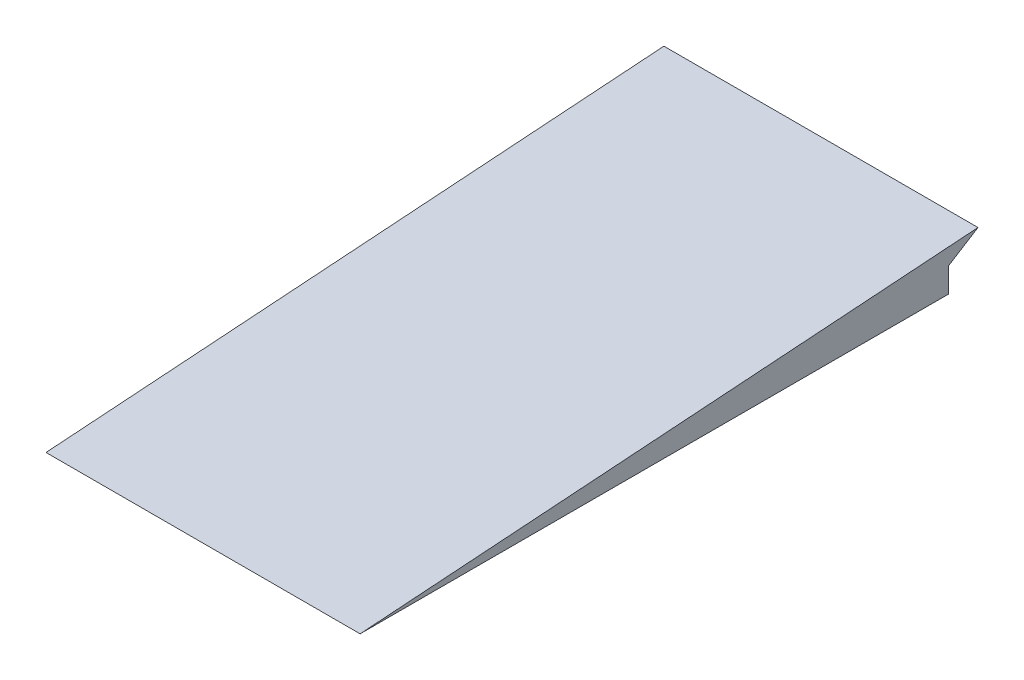
ISO-10303-21;
HEADER;
FILE_DESCRIPTION(('STEP AP214'),'2;1');
FILE_NAME('part.step','',(''),(''),'','','');
FILE_SCHEMA(('AUTOMOTIVE_DESIGN { 1 0 10303 214 1 1 1 1 }'));
ENDSEC;
DATA;
#1=APPLICATION_CONTEXT('core data for automotive mechanical design processes');
#2=APPLICATION_PROTOCOL_DEFINITION('international standard','automotive_design',2000,#1);
#3=PRODUCT_CONTEXT('',#1,'mechanical');
#4=PRODUCT('Part','Part','',(#3));
#5=PRODUCT_RELATED_PRODUCT_CATEGORY('part','',(#4));
#6=PRODUCT_DEFINITION_FORMATION('','',#4);
#7=PRODUCT_DEFINITION_CONTEXT('part definition',#1,'design');
#8=PRODUCT_DEFINITION('design','',#6,#7);
#9=PRODUCT_DEFINITION_SHAPE('','',#8);
#10=(LENGTH_UNIT() NAMED_UNIT(*) SI_UNIT(.MILLI.,.METRE.));
#11=(NAMED_UNIT(*) PLANE_ANGLE_UNIT() SI_UNIT($,.RADIAN.));
#12=(NAMED_UNIT(*) SI_UNIT($,.STERADIAN.) SOLID_ANGLE_UNIT());
#13=UNCERTAINTY_MEASURE_WITH_UNIT(LENGTH_MEASURE(1.E-05),#10,'distance_accuracy_value','');
#14=(GEOMETRIC_REPRESENTATION_CONTEXT(3) GLOBAL_UNCERTAINTY_ASSIGNED_CONTEXT((#13)) GLOBAL_UNIT_ASSIGNED_CONTEXT((#10,
#11,#12)) REPRESENTATION_CONTEXT('',''));
#15=CARTESIAN_POINT('',(0.,0.,0.));
#16=DIRECTION('',(0.,0.,1.));
#17=DIRECTION('',(1.,0.,0.));
#18=AXIS2_PLACEMENT_3D('',#15,#16,#17);
#19=CARTESIAN_POINT('',(812.8,0.,-3045.35301730358));
#20=DIRECTION('',(0.,1.,0.));
#21=DIRECTION('',(0.,0.,1.));
#22=AXIS2_PLACEMENT_3D('',#19,#20,#21);
#23=PLANE('',#22);
#24=DIRECTION('',(0.,0.,-1.));
#25=VECTOR('',#24,1.);
#26=CARTESIAN_POINT('',(-812.8,0.,-3045.35301730358));
#27=LINE('',#26,#25);
#28=CARTESIAN_POINT('',(-812.8,0.,0.));
#29=VERTEX_POINT('',#28);
#30=CARTESIAN_POINT('',(-812.8,0.,-3045.35301730358));
#31=VERTEX_POINT('',#30);
#32=EDGE_CURVE('E86',#29,#31,#27,.T.);
#33=ORIENTED_EDGE('',*,*,#32,.T.);
#34=DIRECTION('',(-1.,0.,0.));
#35=VECTOR('',#34,1.);
#36=CARTESIAN_POINT('',(812.8,0.,-3045.35301730358));
#37=LINE('',#36,#35);
#38=CARTESIAN_POINT('',(812.8,0.,-3045.35301730358));
#39=VERTEX_POINT('',#38);
#40=EDGE_CURVE('E11',#39,#31,#37,.T.);
#41=ORIENTED_EDGE('',*,*,#40,.F.);
#42=DIRECTION('',(0.,0.,-1.));
#43=VECTOR('',#42,1.);
#44=CARTESIAN_POINT('',(812.8,0.,-3045.35301730358));
#45=LINE('',#44,#43);
#46=CARTESIAN_POINT('',(812.8,0.,0.));
#47=VERTEX_POINT('',#46);
#48=EDGE_CURVE('E49',#47,#39,#45,.T.);
#49=ORIENTED_EDGE('',*,*,#48,.F.);
#50=DIRECTION('',(-1.,0.,0.));
#51=VECTOR('',#50,1.);
#52=CARTESIAN_POINT('',(812.8,0.,0.));
#53=LINE('',#52,#51);
#54=EDGE_CURVE('E79',#47,#29,#53,.T.);
#55=ORIENTED_EDGE('',*,*,#54,.T.);
#56=EDGE_LOOP('',(#33,#41,#49,#55));
#57=FACE_BOUND('',#56,.T.);
#58=ADVANCED_FACE('F33',(#57),#23,.F.);
#59=CARTESIAN_POINT('',(812.8,127.,-3045.35301730358));
#60=DIRECTION('',(0.,0.,1.));
#61=DIRECTION('',(1.,0.,0.));
#62=AXIS2_PLACEMENT_3D('',#59,#60,#61);
#63=PLANE('',#62);
#64=DIRECTION('',(0.,1.,0.));
#65=VECTOR('',#64,1.);
#66=CARTESIAN_POINT('',(-812.8,127.,-3045.35301730358));
#67=LINE('',#66,#65);
#68=CARTESIAN_POINT('',(-812.8,127.,-3045.35301730358));
#69=VERTEX_POINT('',#68);
#70=EDGE_CURVE('E62',#31,#69,#67,.T.);
#71=ORIENTED_EDGE('',*,*,#70,.T.);
#72=DIRECTION('',(-1.,0.,0.));
#73=VECTOR('',#72,1.);
#74=CARTESIAN_POINT('',(812.8,127.,-3045.35301730358));
#75=LINE('',#74,#73);
#76=CARTESIAN_POINT('',(812.8,127.,-3045.35301730358));
#77=VERTEX_POINT('',#76);
#78=EDGE_CURVE('E41',#77,#69,#75,.T.);
#79=ORIENTED_EDGE('',*,*,#78,.F.);
#80=DIRECTION('',(0.,1.,0.));
#81=VECTOR('',#80,1.);
#82=CARTESIAN_POINT('',(812.8,127.,-3045.35301730358));
#83=LINE('',#82,#81);
#84=EDGE_CURVE('E72',#39,#77,#83,.T.);
#85=ORIENTED_EDGE('',*,*,#84,.F.);
#86=ORIENTED_EDGE('',*,*,#40,.T.);
#87=EDGE_LOOP('',(#71,#79,#85,#86));
#88=FACE_BOUND('',#87,.T.);
#89=ADVANCED_FACE('F73',(#88),#63,.F.);
#90=CARTESIAN_POINT('',(812.8,0.,0.));
#91=DIRECTION('',(1.,0.,0.));
#92=DIRECTION('',(0.,0.,-1.));
#93=AXIS2_PLACEMENT_3D('',#90,#91,#92);
#94=PLANE('',#93);
#95=ORIENTED_EDGE('',*,*,#48,.T.);
#96=ORIENTED_EDGE('',*,*,#84,.T.);
#97=DIRECTION('',(0.,0.52999894000318,-0.847998304005088));
#98=VECTOR('',#97,1.);
#99=CARTESIAN_POINT('',(812.8,127.,-3045.35301730358));
#100=LINE('',#99,#98);
#101=CARTESIAN_POINT('',(812.8,222.25,-3197.75301730358));
#102=VERTEX_POINT('',#101);
#103=EDGE_CURVE('E98',#77,#102,#100,.T.);
#104=ORIENTED_EDGE('',*,*,#103,.T.);
#105=DIRECTION('',(0.,-0.0693346685711697,0.997593456140389));
#106=VECTOR('',#105,1.);
#107=CARTESIAN_POINT('',(812.8,222.25,-3197.75301730358));
#108=LINE('',#107,#106);
#109=EDGE_CURVE('E84',#102,#47,#108,.T.);
#110=ORIENTED_EDGE('',*,*,#109,.T.);
#111=EDGE_LOOP('',(#95,#96,#104,#110));
#112=FACE_BOUND('',#111,.T.);
#113=ADVANCED_FACE('F82',(#112),#94,.T.);
#114=CARTESIAN_POINT('',(-812.8,0.,0.));
#115=DIRECTION('',(1.,0.,0.));
#116=DIRECTION('',(0.,0.,-1.));
#117=AXIS2_PLACEMENT_3D('',#114,#115,#116);
#118=PLANE('',#117);
#119=ORIENTED_EDGE('',*,*,#32,.F.);
#120=DIRECTION('',(0.,0.0693346685711697,-0.997593456140389));
#121=VECTOR('',#120,1.);
#122=CARTESIAN_POINT('',(-812.8,222.25,-3197.75301730358));
#123=LINE('',#122,#121);
#124=CARTESIAN_POINT('',(-812.8,222.25,-3197.75301730358));
#125=VERTEX_POINT('',#124);
#126=EDGE_CURVE('E91',#29,#125,#123,.T.);
#127=ORIENTED_EDGE('',*,*,#126,.T.);
#128=DIRECTION('',(0.,-0.52999894000318,0.847998304005088));
#129=VECTOR('',#128,1.);
#130=CARTESIAN_POINT('',(-812.8,127.,-3045.35301730358));
#131=LINE('',#130,#129);
#132=EDGE_CURVE('E88',#125,#69,#131,.T.);
#133=ORIENTED_EDGE('',*,*,#132,.T.);
#134=ORIENTED_EDGE('',*,*,#70,.F.);
#135=EDGE_LOOP('',(#119,#127,#133,#134));
#136=FACE_BOUND('',#135,.T.);
#137=ADVANCED_FACE('F105',(#136),#118,.F.);
#138=CARTESIAN_POINT('',(-4018.26711450517,222.25,-3197.75301730358));
#139=DIRECTION('',(0.,0.997593456140389,0.0693346685711697));
#140=DIRECTION('',(0.,-0.0693346685711697,0.997593456140389));
#141=AXIS2_PLACEMENT_3D('',#138,#139,#140);
#142=PLANE('',#141);
#143=ORIENTED_EDGE('',*,*,#126,.F.);
#144=ORIENTED_EDGE('',*,*,#54,.F.);
#145=ORIENTED_EDGE('',*,*,#109,.F.);
#146=DIRECTION('',(1.,0.,0.));
#147=VECTOR('',#146,1.);
#148=CARTESIAN_POINT('',(-4018.26711450517,222.25,-3197.75301730358));
#149=LINE('',#148,#147);
#150=EDGE_CURVE('E100',#125,#102,#149,.T.);
#151=ORIENTED_EDGE('',*,*,#150,.F.);
#152=EDGE_LOOP('',(#143,#144,#145,#151));
#153=FACE_BOUND('',#152,.T.);
#154=ADVANCED_FACE('F107',(#153),#142,.T.);
#155=CARTESIAN_POINT('',(-4018.26711450517,127.,-3045.35301730358));
#156=DIRECTION('',(0.,-0.847998304005088,-0.52999894000318));
#157=DIRECTION('',(0.,0.52999894000318,-0.847998304005088));
#158=AXIS2_PLACEMENT_3D('',#155,#156,#157);
#159=PLANE('',#158);
#160=ORIENTED_EDGE('',*,*,#132,.F.);
#161=ORIENTED_EDGE('',*,*,#150,.T.);
#162=ORIENTED_EDGE('',*,*,#103,.F.);
#163=ORIENTED_EDGE('',*,*,#78,.T.);
#164=EDGE_LOOP('',(#160,#161,#162,#163));
#165=FACE_BOUND('',#164,.T.);
#166=ADVANCED_FACE('F96',(#165),#159,.T.);
#167=CLOSED_SHELL('',(#58,#89,#113,#137,#154,#166));
#168=MANIFOLD_SOLID_BREP('B2',#167);
#169=ADVANCED_BREP_SHAPE_REPRESENTATION('',(#18,#168),#14);
#170=SHAPE_DEFINITION_REPRESENTATION(#9,#169);
ENDSEC;
END-ISO-10303-21;
